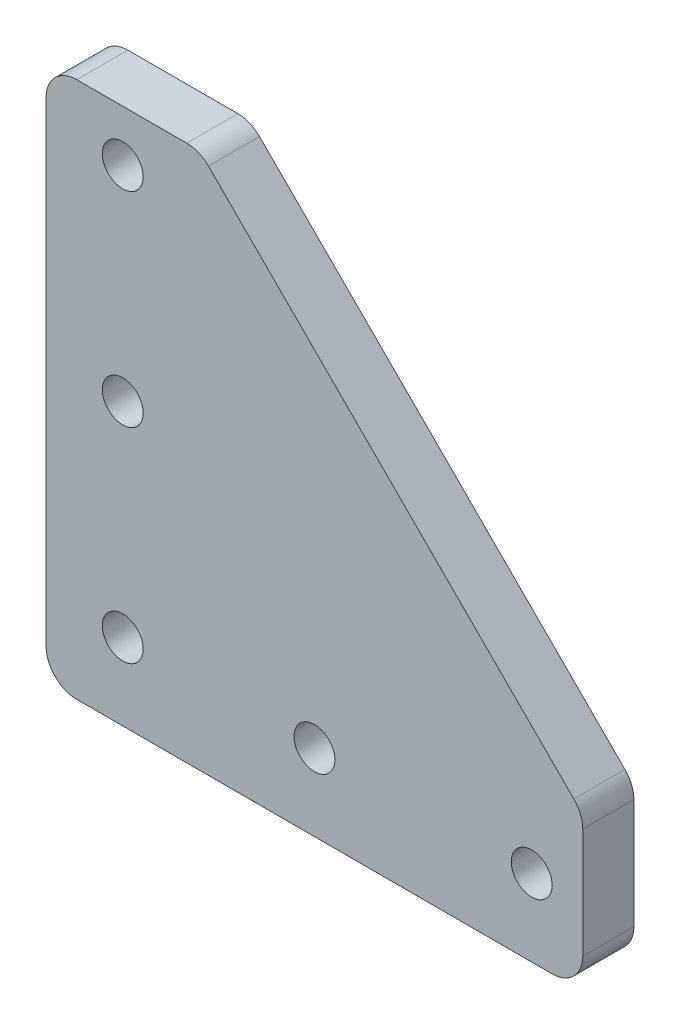
ISO-10303-21;
HEADER;
FILE_DESCRIPTION(('STEP AP214'),'2;1');
FILE_NAME('part.step','',(''),(''),'','','');
FILE_SCHEMA(('AUTOMOTIVE_DESIGN { 1 0 10303 214 1 1 1 1 }'));
ENDSEC;
DATA;
#1=APPLICATION_CONTEXT('core data for automotive mechanical design processes');
#2=APPLICATION_PROTOCOL_DEFINITION('international standard','automotive_design',2000,#1);
#3=PRODUCT_CONTEXT('',#1,'mechanical');
#4=PRODUCT('Part','Part','',(#3));
#5=PRODUCT_RELATED_PRODUCT_CATEGORY('part','',(#4));
#6=PRODUCT_DEFINITION_FORMATION('','',#4);
#7=PRODUCT_DEFINITION_CONTEXT('part definition',#1,'design');
#8=PRODUCT_DEFINITION('design','',#6,#7);
#9=PRODUCT_DEFINITION_SHAPE('','',#8);
#10=(LENGTH_UNIT() NAMED_UNIT(*) SI_UNIT(.MILLI.,.METRE.));
#11=(NAMED_UNIT(*) PLANE_ANGLE_UNIT() SI_UNIT($,.RADIAN.));
#12=(NAMED_UNIT(*) SI_UNIT($,.STERADIAN.) SOLID_ANGLE_UNIT());
#13=UNCERTAINTY_MEASURE_WITH_UNIT(LENGTH_MEASURE(1.E-05),#10,'distance_accuracy_value','');
#14=(GEOMETRIC_REPRESENTATION_CONTEXT(3) GLOBAL_UNCERTAINTY_ASSIGNED_CONTEXT((#13)) GLOBAL_UNIT_ASSIGNED_CONTEXT((#10,
#11,#12)) REPRESENTATION_CONTEXT('',''));
#15=CARTESIAN_POINT('',(0.,0.,0.));
#16=DIRECTION('',(0.,0.,1.));
#17=DIRECTION('',(1.,0.,0.));
#18=AXIS2_PLACEMENT_3D('',#15,#16,#17);
#19=CARTESIAN_POINT('',(0.,0.,5.));
#20=DIRECTION('',(0.,1.,0.));
#21=DIRECTION('',(0.,0.,1.));
#22=AXIS2_PLACEMENT_3D('',#19,#20,#21);
#23=PLANE('',#22);
#24=DIRECTION('',(1.,0.,0.));
#25=VECTOR('',#24,1.);
#26=CARTESIAN_POINT('',(0.,0.,5.));
#27=LINE('',#26,#25);
#28=CARTESIAN_POINT('',(3.,0.,5.));
#29=VERTEX_POINT('',#28);
#30=CARTESIAN_POINT('',(49.5,0.,5.));
#31=VERTEX_POINT('',#30);
#32=EDGE_CURVE('E132',#29,#31,#27,.T.);
#33=ORIENTED_EDGE('',*,*,#32,.F.);
#34=DIRECTION('',(0.,0.,-1.));
#35=VECTOR('',#34,1.);
#36=CARTESIAN_POINT('',(3.,0.,0.));
#37=LINE('',#36,#35);
#38=CARTESIAN_POINT('',(3.,0.,0.));
#39=VERTEX_POINT('',#38);
#40=EDGE_CURVE('E117',#29,#39,#37,.T.);
#41=ORIENTED_EDGE('',*,*,#40,.T.);
#42=DIRECTION('',(1.,0.,0.));
#43=VECTOR('',#42,1.);
#44=CARTESIAN_POINT('',(0.,0.,0.));
#45=LINE('',#44,#43);
#46=CARTESIAN_POINT('',(49.5,0.,0.));
#47=VERTEX_POINT('',#46);
#48=EDGE_CURVE('E129',#39,#47,#45,.T.);
#49=ORIENTED_EDGE('',*,*,#48,.T.);
#50=DIRECTION('',(0.,0.,-1.));
#51=VECTOR('',#50,1.);
#52=CARTESIAN_POINT('',(49.5,0.,5.));
#53=LINE('',#52,#51);
#54=EDGE_CURVE('E134',#47,#31,#53,.F.);
#55=ORIENTED_EDGE('',*,*,#54,.T.);
#56=EDGE_LOOP('',(#33,#41,#49,#55));
#57=FACE_BOUND('',#56,.T.);
#58=ADVANCED_FACE('F35',(#57),#23,.F.);
#59=CARTESIAN_POINT('',(52.5,0.,5.));
#60=DIRECTION('',(-1.,0.,0.));
#61=DIRECTION('',(0.,0.,1.));
#62=AXIS2_PLACEMENT_3D('',#59,#60,#61);
#63=PLANE('',#62);
#64=DIRECTION('',(0.,1.,0.));
#65=VECTOR('',#64,1.);
#66=CARTESIAN_POINT('',(52.5,0.,5.));
#67=LINE('',#66,#65);
#68=CARTESIAN_POINT('',(52.5,3.,5.));
#69=VERTEX_POINT('',#68);
#70=CARTESIAN_POINT('',(52.5,13.7573593128807,5.));
#71=VERTEX_POINT('',#70);
#72=EDGE_CURVE('E204',#69,#71,#67,.T.);
#73=ORIENTED_EDGE('',*,*,#72,.F.);
#74=DIRECTION('',(0.,0.,-1.));
#75=VECTOR('',#74,1.);
#76=CARTESIAN_POINT('',(52.5,3.,5.));
#77=LINE('',#76,#75);
#78=CARTESIAN_POINT('',(52.5,3.,0.));
#79=VERTEX_POINT('',#78);
#80=EDGE_CURVE('E179',#69,#79,#77,.T.);
#81=ORIENTED_EDGE('',*,*,#80,.T.);
#82=DIRECTION('',(0.,1.,0.));
#83=VECTOR('',#82,1.);
#84=CARTESIAN_POINT('',(52.5,0.,0.));
#85=LINE('',#84,#83);
#86=CARTESIAN_POINT('',(52.5,13.7573593128807,0.));
#87=VERTEX_POINT('',#86);
#88=EDGE_CURVE('E138',#79,#87,#85,.T.);
#89=ORIENTED_EDGE('',*,*,#88,.T.);
#90=DIRECTION('',(0.,0.,-1.));
#91=VECTOR('',#90,1.);
#92=CARTESIAN_POINT('',(52.5,13.7573593128807,5.));
#93=LINE('',#92,#91);
#94=EDGE_CURVE('E177',#87,#71,#93,.F.);
#95=ORIENTED_EDGE('',*,*,#94,.T.);
#96=EDGE_LOOP('',(#73,#81,#89,#95));
#97=FACE_BOUND('',#96,.T.);
#98=ADVANCED_FACE('F238',(#97),#63,.F.);
#99=CARTESIAN_POINT('',(33.75,33.75,5.));
#100=DIRECTION('',(0.707106781186548,0.707106781186548,0.));
#101=DIRECTION('',(-0.707106781186548,0.707106781186548,0.));
#102=AXIS2_PLACEMENT_3D('',#99,#100,#101);
#103=PLANE('',#102);
#104=DIRECTION('',(0.707106781186548,-0.707106781186548,0.));
#105=VECTOR('',#104,1.);
#106=CARTESIAN_POINT('',(33.75,33.75,5.));
#107=LINE('',#106,#105);
#108=CARTESIAN_POINT('',(15.8786796564403,51.6213203435596,5.));
#109=VERTEX_POINT('',#108);
#110=CARTESIAN_POINT('',(51.6213203435596,15.8786796564403,5.));
#111=VERTEX_POINT('',#110);
#112=EDGE_CURVE('E192',#109,#111,#107,.T.);
#113=ORIENTED_EDGE('',*,*,#112,.T.);
#114=DIRECTION('',(0.,0.,-1.));
#115=VECTOR('',#114,1.);
#116=CARTESIAN_POINT('',(51.6213203435596,15.8786796564403,0.));
#117=LINE('',#116,#115);
#118=CARTESIAN_POINT('',(51.6213203435596,15.8786796564403,0.));
#119=VERTEX_POINT('',#118);
#120=EDGE_CURVE('E184',#111,#119,#117,.T.);
#121=ORIENTED_EDGE('',*,*,#120,.T.);
#122=DIRECTION('',(0.707106781186548,-0.707106781186548,0.));
#123=VECTOR('',#122,1.);
#124=CARTESIAN_POINT('',(33.75,33.75,0.));
#125=LINE('',#124,#123);
#126=CARTESIAN_POINT('',(15.8786796564403,51.6213203435596,0.));
#127=VERTEX_POINT('',#126);
#128=EDGE_CURVE('E142',#127,#119,#125,.T.);
#129=ORIENTED_EDGE('',*,*,#128,.F.);
#130=DIRECTION('',(0.,0.,-1.));
#131=VECTOR('',#130,1.);
#132=CARTESIAN_POINT('',(15.8786796564403,51.6213203435596,5.));
#133=LINE('',#132,#131);
#134=EDGE_CURVE('E182',#127,#109,#133,.F.);
#135=ORIENTED_EDGE('',*,*,#134,.T.);
#136=EDGE_LOOP('',(#113,#121,#129,#135));
#137=FACE_BOUND('',#136,.T.);
#138=ADVANCED_FACE('F190',(#137),#103,.T.);
#139=CARTESIAN_POINT('',(0.,52.5,5.));
#140=DIRECTION('',(0.,1.,0.));
#141=DIRECTION('',(0.,0.,1.));
#142=AXIS2_PLACEMENT_3D('',#139,#140,#141);
#143=PLANE('',#142);
#144=DIRECTION('',(1.,0.,0.));
#145=VECTOR('',#144,1.);
#146=CARTESIAN_POINT('',(0.,52.5,5.));
#147=LINE('',#146,#145);
#148=CARTESIAN_POINT('',(3.,52.5,5.));
#149=VERTEX_POINT('',#148);
#150=CARTESIAN_POINT('',(13.7573593128807,52.5,5.));
#151=VERTEX_POINT('',#150);
#152=EDGE_CURVE('E199',#149,#151,#147,.T.);
#153=ORIENTED_EDGE('',*,*,#152,.T.);
#154=DIRECTION('',(0.,0.,-1.));
#155=VECTOR('',#154,1.);
#156=CARTESIAN_POINT('',(13.7573593128807,52.5,5.));
#157=LINE('',#156,#155);
#158=CARTESIAN_POINT('',(13.7573593128807,52.5,0.));
#159=VERTEX_POINT('',#158);
#160=EDGE_CURVE('E11',#151,#159,#157,.T.);
#161=ORIENTED_EDGE('',*,*,#160,.T.);
#162=DIRECTION('',(1.,0.,0.));
#163=VECTOR('',#162,1.);
#164=CARTESIAN_POINT('',(0.,52.5,0.));
#165=LINE('',#164,#163);
#166=CARTESIAN_POINT('',(3.,52.5,0.));
#167=VERTEX_POINT('',#166);
#168=EDGE_CURVE('E151',#167,#159,#165,.T.);
#169=ORIENTED_EDGE('',*,*,#168,.F.);
#170=DIRECTION('',(0.,0.,-1.));
#171=VECTOR('',#170,1.);
#172=CARTESIAN_POINT('',(3.,52.5,5.));
#173=LINE('',#172,#171);
#174=EDGE_CURVE('E43',#167,#149,#173,.F.);
#175=ORIENTED_EDGE('',*,*,#174,.T.);
#176=EDGE_LOOP('',(#153,#161,#169,#175));
#177=FACE_BOUND('',#176,.T.);
#178=ADVANCED_FACE('F198',(#177),#143,.T.);
#179=CARTESIAN_POINT('',(7.5,7.5,5.));
#180=DIRECTION('',(0.,0.,-1.));
#181=DIRECTION('',(-1.,0.,0.));
#182=AXIS2_PLACEMENT_3D('',#179,#180,#181);
#183=CYLINDRICAL_SURFACE('',#182,2.);
#184=CARTESIAN_POINT('',(7.5,7.5,5.));
#185=DIRECTION('',(0.,0.,1.));
#186=DIRECTION('',(1.,0.,0.));
#187=AXIS2_PLACEMENT_3D('',#184,#185,#186);
#188=CIRCLE('',#187,2.);
#189=CARTESIAN_POINT('',(9.5,7.5,5.));
#190=VERTEX_POINT('',#189);
#191=EDGE_CURVE('E279',#190,#190,#188,.T.);
#192=ORIENTED_EDGE('',*,*,#191,.T.);
#193=EDGE_LOOP('',(#192));
#194=FACE_BOUND('',#193,.T.);
#195=CARTESIAN_POINT('',(7.5,7.5,0.));
#196=DIRECTION('',(0.,0.,1.));
#197=DIRECTION('',(1.,0.,0.));
#198=AXIS2_PLACEMENT_3D('',#195,#196,#197);
#199=CIRCLE('',#198,2.);
#200=CARTESIAN_POINT('',(9.5,7.5,0.));
#201=VERTEX_POINT('',#200);
#202=EDGE_CURVE('E139',#201,#201,#199,.T.);
#203=ORIENTED_EDGE('',*,*,#202,.F.);
#204=EDGE_LOOP('',(#203));
#205=FACE_BOUND('',#204,.T.);
#206=ADVANCED_FACE('F224',(#194,#205),#183,.F.);
#207=CARTESIAN_POINT('',(7.5,47.5,5.));
#208=DIRECTION('',(0.,0.,-1.));
#209=DIRECTION('',(-1.,0.,0.));
#210=AXIS2_PLACEMENT_3D('',#207,#208,#209);
#211=CYLINDRICAL_SURFACE('',#210,2.);
#212=CARTESIAN_POINT('',(7.5,47.5,5.));
#213=DIRECTION('',(0.,0.,1.));
#214=DIRECTION('',(1.,0.,0.));
#215=AXIS2_PLACEMENT_3D('',#212,#213,#214);
#216=CIRCLE('',#215,2.);
#217=CARTESIAN_POINT('',(9.5,47.5,5.));
#218=VERTEX_POINT('',#217);
#219=EDGE_CURVE('E276',#218,#218,#216,.T.);
#220=ORIENTED_EDGE('',*,*,#219,.T.);
#221=EDGE_LOOP('',(#220));
#222=FACE_BOUND('',#221,.T.);
#223=CARTESIAN_POINT('',(7.5,47.5,0.));
#224=DIRECTION('',(0.,0.,1.));
#225=DIRECTION('',(1.,0.,0.));
#226=AXIS2_PLACEMENT_3D('',#223,#224,#225);
#227=CIRCLE('',#226,2.);
#228=CARTESIAN_POINT('',(9.5,47.5,0.));
#229=VERTEX_POINT('',#228);
#230=EDGE_CURVE('E145',#229,#229,#227,.T.);
#231=ORIENTED_EDGE('',*,*,#230,.F.);
#232=EDGE_LOOP('',(#231));
#233=FACE_BOUND('',#232,.T.);
#234=ADVANCED_FACE('F221',(#222,#233),#211,.F.);
#235=CARTESIAN_POINT('',(47.5,7.5,5.));
#236=DIRECTION('',(0.,0.,-1.));
#237=DIRECTION('',(-1.,0.,0.));
#238=AXIS2_PLACEMENT_3D('',#235,#236,#237);
#239=CYLINDRICAL_SURFACE('',#238,2.);
#240=CARTESIAN_POINT('',(47.5,7.5,5.));
#241=DIRECTION('',(0.,0.,1.));
#242=DIRECTION('',(1.,0.,0.));
#243=AXIS2_PLACEMENT_3D('',#240,#241,#242);
#244=CIRCLE('',#243,2.);
#245=CARTESIAN_POINT('',(49.5,7.5,5.));
#246=VERTEX_POINT('',#245);
#247=EDGE_CURVE('E273',#246,#246,#244,.T.);
#248=ORIENTED_EDGE('',*,*,#247,.T.);
#249=EDGE_LOOP('',(#248));
#250=FACE_BOUND('',#249,.T.);
#251=CARTESIAN_POINT('',(47.5,7.5,0.));
#252=DIRECTION('',(0.,0.,1.));
#253=DIRECTION('',(1.,0.,0.));
#254=AXIS2_PLACEMENT_3D('',#251,#252,#253);
#255=CIRCLE('',#254,2.);
#256=CARTESIAN_POINT('',(49.5,7.5,0.));
#257=VERTEX_POINT('',#256);
#258=EDGE_CURVE('E214',#257,#257,#255,.T.);
#259=ORIENTED_EDGE('',*,*,#258,.F.);
#260=EDGE_LOOP('',(#259));
#261=FACE_BOUND('',#260,.T.);
#262=ADVANCED_FACE('F223',(#250,#261),#239,.F.);
#263=CARTESIAN_POINT('',(7.5,27.5,5.));
#264=DIRECTION('',(0.,0.,-1.));
#265=DIRECTION('',(-1.,0.,0.));
#266=AXIS2_PLACEMENT_3D('',#263,#264,#265);
#267=CYLINDRICAL_SURFACE('',#266,2.);
#268=CARTESIAN_POINT('',(7.5,27.5,5.));
#269=DIRECTION('',(0.,0.,1.));
#270=DIRECTION('',(1.,0.,0.));
#271=AXIS2_PLACEMENT_3D('',#268,#269,#270);
#272=CIRCLE('',#271,2.);
#273=CARTESIAN_POINT('',(9.5,27.5,5.));
#274=VERTEX_POINT('',#273);
#275=EDGE_CURVE('E269',#274,#274,#272,.T.);
#276=ORIENTED_EDGE('',*,*,#275,.T.);
#277=EDGE_LOOP('',(#276));
#278=FACE_BOUND('',#277,.T.);
#279=CARTESIAN_POINT('',(7.5,27.5,0.));
#280=DIRECTION('',(0.,0.,1.));
#281=DIRECTION('',(1.,0.,0.));
#282=AXIS2_PLACEMENT_3D('',#279,#280,#281);
#283=CIRCLE('',#282,2.);
#284=CARTESIAN_POINT('',(9.5,27.5,0.));
#285=VERTEX_POINT('',#284);
#286=EDGE_CURVE('E211',#285,#285,#283,.T.);
#287=ORIENTED_EDGE('',*,*,#286,.F.);
#288=EDGE_LOOP('',(#287));
#289=FACE_BOUND('',#288,.T.);
#290=ADVANCED_FACE('F231',(#278,#289),#267,.F.);
#291=CARTESIAN_POINT('',(26.25,7.5,5.));
#292=DIRECTION('',(0.,0.,-1.));
#293=DIRECTION('',(-1.,0.,0.));
#294=AXIS2_PLACEMENT_3D('',#291,#292,#293);
#295=CYLINDRICAL_SURFACE('',#294,2.);
#296=CARTESIAN_POINT('',(26.25,7.5,5.));
#297=DIRECTION('',(0.,0.,1.));
#298=DIRECTION('',(1.,0.,0.));
#299=AXIS2_PLACEMENT_3D('',#296,#297,#298);
#300=CIRCLE('',#299,2.);
#301=CARTESIAN_POINT('',(28.25,7.5,5.));
#302=VERTEX_POINT('',#301);
#303=EDGE_CURVE('E156',#302,#302,#300,.T.);
#304=ORIENTED_EDGE('',*,*,#303,.T.);
#305=EDGE_LOOP('',(#304));
#306=FACE_BOUND('',#305,.T.);
#307=CARTESIAN_POINT('',(26.25,7.5,0.));
#308=DIRECTION('',(0.,0.,1.));
#309=DIRECTION('',(1.,0.,0.));
#310=AXIS2_PLACEMENT_3D('',#307,#308,#309);
#311=CIRCLE('',#310,2.);
#312=CARTESIAN_POINT('',(28.25,7.5,0.));
#313=VERTEX_POINT('',#312);
#314=EDGE_CURVE('E208',#313,#313,#311,.T.);
#315=ORIENTED_EDGE('',*,*,#314,.F.);
#316=EDGE_LOOP('',(#315));
#317=FACE_BOUND('',#316,.T.);
#318=ADVANCED_FACE('F254',(#306,#317),#295,.F.);
#319=CARTESIAN_POINT('',(0.,0.,5.));
#320=DIRECTION('',(-1.,0.,0.));
#321=DIRECTION('',(0.,0.,1.));
#322=AXIS2_PLACEMENT_3D('',#319,#320,#321);
#323=PLANE('',#322);
#324=DIRECTION('',(0.,1.,0.));
#325=VECTOR('',#324,1.);
#326=CARTESIAN_POINT('',(0.,0.,0.));
#327=LINE('',#326,#325);
#328=CARTESIAN_POINT('',(0.,3.,0.));
#329=VERTEX_POINT('',#328);
#330=CARTESIAN_POINT('',(0.,49.5,0.));
#331=VERTEX_POINT('',#330);
#332=EDGE_CURVE('E154',#329,#331,#327,.T.);
#333=ORIENTED_EDGE('',*,*,#332,.F.);
#334=DIRECTION('',(0.,0.,-1.));
#335=VECTOR('',#334,1.);
#336=CARTESIAN_POINT('',(0.,3.,5.));
#337=LINE('',#336,#335);
#338=CARTESIAN_POINT('',(0.,3.,5.));
#339=VERTEX_POINT('',#338);
#340=EDGE_CURVE('E118',#329,#339,#337,.F.);
#341=ORIENTED_EDGE('',*,*,#340,.T.);
#342=DIRECTION('',(0.,1.,0.));
#343=VECTOR('',#342,1.);
#344=CARTESIAN_POINT('',(0.,0.,5.));
#345=LINE('',#344,#343);
#346=CARTESIAN_POINT('',(0.,49.5,5.));
#347=VERTEX_POINT('',#346);
#348=EDGE_CURVE('E157',#339,#347,#345,.T.);
#349=ORIENTED_EDGE('',*,*,#348,.T.);
#350=DIRECTION('',(0.,0.,-1.));
#351=VECTOR('',#350,1.);
#352=CARTESIAN_POINT('',(0.,49.5,5.));
#353=LINE('',#352,#351);
#354=EDGE_CURVE('E123',#347,#331,#353,.T.);
#355=ORIENTED_EDGE('',*,*,#354,.T.);
#356=EDGE_LOOP('',(#333,#341,#349,#355));
#357=FACE_BOUND('',#356,.T.);
#358=ADVANCED_FACE('F250',(#357),#323,.T.);
#359=CARTESIAN_POINT('',(0.,0.,5.));
#360=DIRECTION('',(0.,0.,1.));
#361=DIRECTION('',(1.,0.,0.));
#362=AXIS2_PLACEMENT_3D('',#359,#360,#361);
#363=PLANE('',#362);
#364=ORIENTED_EDGE('',*,*,#303,.F.);
#365=EDGE_LOOP('',(#364));
#366=FACE_BOUND('',#365,.T.);
#367=ORIENTED_EDGE('',*,*,#275,.F.);
#368=EDGE_LOOP('',(#367));
#369=FACE_BOUND('',#368,.T.);
#370=ORIENTED_EDGE('',*,*,#247,.F.);
#371=EDGE_LOOP('',(#370));
#372=FACE_BOUND('',#371,.T.);
#373=ORIENTED_EDGE('',*,*,#219,.F.);
#374=EDGE_LOOP('',(#373));
#375=FACE_BOUND('',#374,.T.);
#376=ORIENTED_EDGE('',*,*,#191,.F.);
#377=EDGE_LOOP('',(#376));
#378=FACE_BOUND('',#377,.T.);
#379=ORIENTED_EDGE('',*,*,#348,.F.);
#380=CARTESIAN_POINT('',(3.,3.,5.));
#381=DIRECTION('',(0.,0.,1.));
#382=DIRECTION('',(1.,0.,0.));
#383=AXIS2_PLACEMENT_3D('',#380,#381,#382);
#384=CIRCLE('',#383,3.);
#385=EDGE_CURVE('E175',#339,#29,#384,.T.);
#386=ORIENTED_EDGE('',*,*,#385,.T.);
#387=ORIENTED_EDGE('',*,*,#32,.T.);
#388=CARTESIAN_POINT('',(49.5,3.,5.));
#389=DIRECTION('',(0.,0.,1.));
#390=DIRECTION('',(1.,0.,0.));
#391=AXIS2_PLACEMENT_3D('',#388,#389,#390);
#392=CIRCLE('',#391,3.);
#393=EDGE_CURVE('E173',#31,#69,#392,.T.);
#394=ORIENTED_EDGE('',*,*,#393,.T.);
#395=ORIENTED_EDGE('',*,*,#72,.T.);
#396=CARTESIAN_POINT('',(49.5,13.7573593128807,5.));
#397=DIRECTION('',(0.,0.,1.));
#398=DIRECTION('',(1.,0.,0.));
#399=AXIS2_PLACEMENT_3D('',#396,#397,#398);
#400=CIRCLE('',#399,3.);
#401=EDGE_CURVE('E171',#71,#111,#400,.T.);
#402=ORIENTED_EDGE('',*,*,#401,.T.);
#403=ORIENTED_EDGE('',*,*,#112,.F.);
#404=CARTESIAN_POINT('',(13.7573593128807,49.5,5.));
#405=DIRECTION('',(0.,0.,1.));
#406=DIRECTION('',(1.,0.,0.));
#407=AXIS2_PLACEMENT_3D('',#404,#405,#406);
#408=CIRCLE('',#407,3.);
#409=EDGE_CURVE('E50',#109,#151,#408,.T.);
#410=ORIENTED_EDGE('',*,*,#409,.T.);
#411=ORIENTED_EDGE('',*,*,#152,.F.);
#412=CARTESIAN_POINT('',(3.,49.5,5.));
#413=DIRECTION('',(0.,0.,1.));
#414=DIRECTION('',(1.,0.,0.));
#415=AXIS2_PLACEMENT_3D('',#412,#413,#414);
#416=CIRCLE('',#415,3.);
#417=EDGE_CURVE('E168',#149,#347,#416,.T.);
#418=ORIENTED_EDGE('',*,*,#417,.T.);
#419=EDGE_LOOP('',(#379,#386,#387,#394,#395,#402,#403,#410,#411,#418));
#420=FACE_BOUND('',#419,.T.);
#421=ADVANCED_FACE('F253',(#366,#369,#372,#375,#378,#420),#363,.T.);
#422=CARTESIAN_POINT('',(0.,0.,0.));
#423=DIRECTION('',(0.,0.,1.));
#424=DIRECTION('',(1.,0.,0.));
#425=AXIS2_PLACEMENT_3D('',#422,#423,#424);
#426=PLANE('',#425);
#427=ORIENTED_EDGE('',*,*,#314,.T.);
#428=EDGE_LOOP('',(#427));
#429=FACE_BOUND('',#428,.T.);
#430=ORIENTED_EDGE('',*,*,#286,.T.);
#431=EDGE_LOOP('',(#430));
#432=FACE_BOUND('',#431,.T.);
#433=ORIENTED_EDGE('',*,*,#258,.T.);
#434=EDGE_LOOP('',(#433));
#435=FACE_BOUND('',#434,.T.);
#436=ORIENTED_EDGE('',*,*,#230,.T.);
#437=EDGE_LOOP('',(#436));
#438=FACE_BOUND('',#437,.T.);
#439=ORIENTED_EDGE('',*,*,#202,.T.);
#440=EDGE_LOOP('',(#439));
#441=FACE_BOUND('',#440,.T.);
#442=ORIENTED_EDGE('',*,*,#48,.F.);
#443=CARTESIAN_POINT('',(3.,3.,0.));
#444=DIRECTION('',(0.,0.,1.));
#445=DIRECTION('',(1.,0.,0.));
#446=AXIS2_PLACEMENT_3D('',#443,#444,#445);
#447=CIRCLE('',#446,3.);
#448=EDGE_CURVE('E113',#39,#329,#447,.F.);
#449=ORIENTED_EDGE('',*,*,#448,.T.);
#450=ORIENTED_EDGE('',*,*,#332,.T.);
#451=CARTESIAN_POINT('',(3.,49.5,0.));
#452=DIRECTION('',(0.,0.,1.));
#453=DIRECTION('',(1.,0.,0.));
#454=AXIS2_PLACEMENT_3D('',#451,#452,#453);
#455=CIRCLE('',#454,3.);
#456=EDGE_CURVE('E133',#331,#167,#455,.F.);
#457=ORIENTED_EDGE('',*,*,#456,.T.);
#458=ORIENTED_EDGE('',*,*,#168,.T.);
#459=CARTESIAN_POINT('',(13.7573593128807,49.5,0.));
#460=DIRECTION('',(0.,0.,1.));
#461=DIRECTION('',(1.,0.,0.));
#462=AXIS2_PLACEMENT_3D('',#459,#460,#461);
#463=CIRCLE('',#462,3.);
#464=EDGE_CURVE('E160',#159,#127,#463,.F.);
#465=ORIENTED_EDGE('',*,*,#464,.T.);
#466=ORIENTED_EDGE('',*,*,#128,.T.);
#467=CARTESIAN_POINT('',(49.5,13.7573593128807,0.));
#468=DIRECTION('',(0.,0.,1.));
#469=DIRECTION('',(1.,0.,0.));
#470=AXIS2_PLACEMENT_3D('',#467,#468,#469);
#471=CIRCLE('',#470,3.);
#472=EDGE_CURVE('E162',#119,#87,#471,.F.);
#473=ORIENTED_EDGE('',*,*,#472,.T.);
#474=ORIENTED_EDGE('',*,*,#88,.F.);
#475=CARTESIAN_POINT('',(49.5,3.,0.));
#476=DIRECTION('',(0.,0.,1.));
#477=DIRECTION('',(1.,0.,0.));
#478=AXIS2_PLACEMENT_3D('',#475,#476,#477);
#479=CIRCLE('',#478,3.);
#480=EDGE_CURVE('E124',#79,#47,#479,.F.);
#481=ORIENTED_EDGE('',*,*,#480,.T.);
#482=EDGE_LOOP('',(#442,#449,#450,#457,#458,#465,#466,#473,#474,#481));
#483=FACE_BOUND('',#482,.T.);
#484=ADVANCED_FACE('F136',(#429,#432,#435,#438,#441,#483),#426,.F.);
#485=CARTESIAN_POINT('',(3.,3.,5.));
#486=DIRECTION('',(0.,0.,1.));
#487=DIRECTION('',(1.,0.,0.));
#488=AXIS2_PLACEMENT_3D('',#485,#486,#487);
#489=CYLINDRICAL_SURFACE('',#488,3.);
#490=ORIENTED_EDGE('',*,*,#385,.F.);
#491=ORIENTED_EDGE('',*,*,#340,.F.);
#492=ORIENTED_EDGE('',*,*,#448,.F.);
#493=ORIENTED_EDGE('',*,*,#40,.F.);
#494=EDGE_LOOP('',(#490,#491,#492,#493));
#495=FACE_BOUND('',#494,.T.);
#496=ADVANCED_FACE('F116',(#495),#489,.T.);
#497=CARTESIAN_POINT('',(49.5,3.,5.));
#498=DIRECTION('',(0.,0.,-1.));
#499=DIRECTION('',(-1.,0.,0.));
#500=AXIS2_PLACEMENT_3D('',#497,#498,#499);
#501=CYLINDRICAL_SURFACE('',#500,3.);
#502=ORIENTED_EDGE('',*,*,#393,.F.);
#503=ORIENTED_EDGE('',*,*,#54,.F.);
#504=ORIENTED_EDGE('',*,*,#480,.F.);
#505=ORIENTED_EDGE('',*,*,#80,.F.);
#506=EDGE_LOOP('',(#502,#503,#504,#505));
#507=FACE_BOUND('',#506,.T.);
#508=ADVANCED_FACE('F291',(#507),#501,.T.);
#509=CARTESIAN_POINT('',(49.5,13.7573593128807,5.));
#510=DIRECTION('',(0.,0.,1.));
#511=DIRECTION('',(1.,0.,0.));
#512=AXIS2_PLACEMENT_3D('',#509,#510,#511);
#513=CYLINDRICAL_SURFACE('',#512,3.);
#514=ORIENTED_EDGE('',*,*,#401,.F.);
#515=ORIENTED_EDGE('',*,*,#94,.F.);
#516=ORIENTED_EDGE('',*,*,#472,.F.);
#517=ORIENTED_EDGE('',*,*,#120,.F.);
#518=EDGE_LOOP('',(#514,#515,#516,#517));
#519=FACE_BOUND('',#518,.T.);
#520=ADVANCED_FACE('F287',(#519),#513,.T.);
#521=CARTESIAN_POINT('',(13.7573593128807,49.5,5.));
#522=DIRECTION('',(0.,0.,-1.));
#523=DIRECTION('',(-1.,0.,0.));
#524=AXIS2_PLACEMENT_3D('',#521,#522,#523);
#525=CYLINDRICAL_SURFACE('',#524,3.);
#526=ORIENTED_EDGE('',*,*,#409,.F.);
#527=ORIENTED_EDGE('',*,*,#134,.F.);
#528=ORIENTED_EDGE('',*,*,#464,.F.);
#529=ORIENTED_EDGE('',*,*,#160,.F.);
#530=EDGE_LOOP('',(#526,#527,#528,#529));
#531=FACE_BOUND('',#530,.T.);
#532=ADVANCED_FACE('F197',(#531),#525,.T.);
#533=CARTESIAN_POINT('',(3.,49.5,5.));
#534=DIRECTION('',(0.,0.,-1.));
#535=DIRECTION('',(-1.,0.,0.));
#536=AXIS2_PLACEMENT_3D('',#533,#534,#535);
#537=CYLINDRICAL_SURFACE('',#536,3.);
#538=ORIENTED_EDGE('',*,*,#417,.F.);
#539=ORIENTED_EDGE('',*,*,#174,.F.);
#540=ORIENTED_EDGE('',*,*,#456,.F.);
#541=ORIENTED_EDGE('',*,*,#354,.F.);
#542=EDGE_LOOP('',(#538,#539,#540,#541));
#543=FACE_BOUND('',#542,.T.);
#544=ADVANCED_FACE('F37',(#543),#537,.T.);
#545=CLOSED_SHELL('',(#58,#98,#138,#178,#206,#234,#262,#290,#318,#358,#421,#484,#496,#508,#520,
#532,#544));
#546=MANIFOLD_SOLID_BREP('B2',#545);
#547=ADVANCED_BREP_SHAPE_REPRESENTATION('',(#18,#546),#14);
#548=SHAPE_DEFINITION_REPRESENTATION(#9,#547);
ENDSEC;
END-ISO-10303-21;
